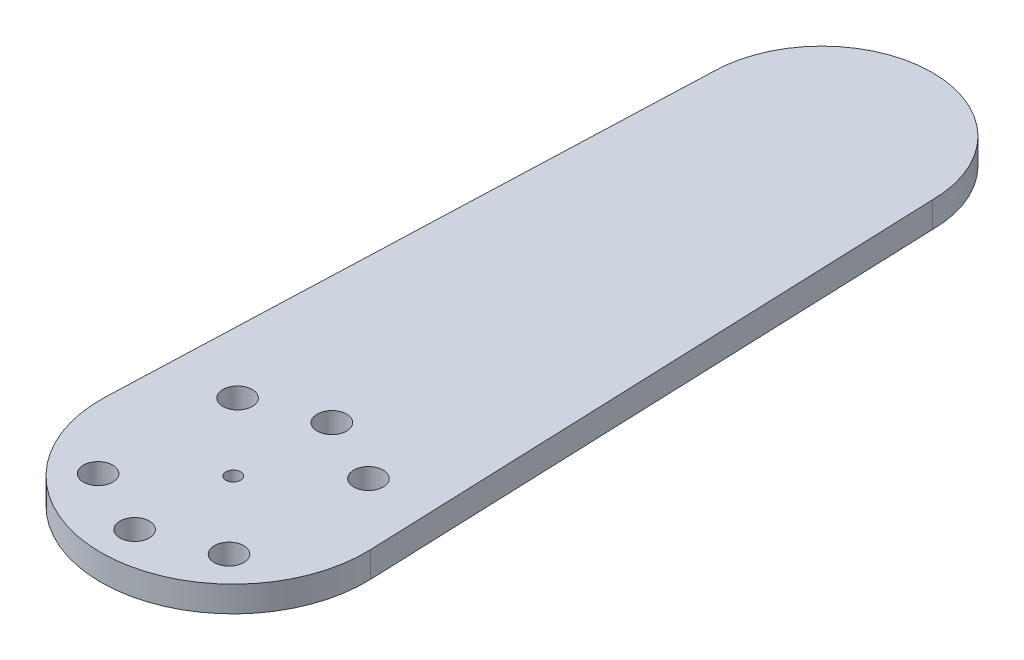
ISO-10303-21;
HEADER;
FILE_DESCRIPTION(('STEP AP214'),'2;1');
FILE_NAME('part.step','',(''),(''),'','','');
FILE_SCHEMA(('AUTOMOTIVE_DESIGN { 1 0 10303 214 1 1 1 1 }'));
ENDSEC;
DATA;
#1=APPLICATION_CONTEXT('core data for automotive mechanical design processes');
#2=APPLICATION_PROTOCOL_DEFINITION('international standard','automotive_design',2000,#1);
#3=PRODUCT_CONTEXT('',#1,'mechanical');
#4=PRODUCT('Part','Part','',(#3));
#5=PRODUCT_RELATED_PRODUCT_CATEGORY('part','',(#4));
#6=PRODUCT_DEFINITION_FORMATION('','',#4);
#7=PRODUCT_DEFINITION_CONTEXT('part definition',#1,'design');
#8=PRODUCT_DEFINITION('design','',#6,#7);
#9=PRODUCT_DEFINITION_SHAPE('','',#8);
#10=(LENGTH_UNIT() NAMED_UNIT(*) SI_UNIT(.MILLI.,.METRE.));
#11=(NAMED_UNIT(*) PLANE_ANGLE_UNIT() SI_UNIT($,.RADIAN.));
#12=(NAMED_UNIT(*) SI_UNIT($,.STERADIAN.) SOLID_ANGLE_UNIT());
#13=UNCERTAINTY_MEASURE_WITH_UNIT(LENGTH_MEASURE(1.E-05),#10,'distance_accuracy_value','');
#14=(GEOMETRIC_REPRESENTATION_CONTEXT(3) GLOBAL_UNCERTAINTY_ASSIGNED_CONTEXT((#13)) GLOBAL_UNIT_ASSIGNED_CONTEXT((#10,
#11,#12)) REPRESENTATION_CONTEXT('',''));
#15=CARTESIAN_POINT('',(0.,0.,0.));
#16=DIRECTION('',(0.,0.,1.));
#17=DIRECTION('',(1.,0.,0.));
#18=AXIS2_PLACEMENT_3D('',#15,#16,#17);
#19=CARTESIAN_POINT('',(0.,3.5,-80.));
#20=DIRECTION('',(0.,1.,0.));
#21=DIRECTION('',(0.,0.,1.));
#22=AXIS2_PLACEMENT_3D('',#19,#20,#21);
#23=PLANE('',#22);
#24=CARTESIAN_POINT('',(-8.89864082924176,3.5,-9.4770349472894));
#25=DIRECTION('',(0.,-1.,0.));
#26=DIRECTION('',(0.,0.,-1.));
#27=AXIS2_PLACEMENT_3D('',#24,#25,#26);
#28=CIRCLE('',#27,2.);
#29=CARTESIAN_POINT('',(-8.89864082924176,3.5,-11.4770349472894));
#30=VERTEX_POINT('',#29);
#31=EDGE_CURVE('E146',#30,#30,#28,.T.);
#32=ORIENTED_EDGE('',*,*,#31,.T.);
#33=EDGE_LOOP('',(#32));
#34=FACE_BOUND('',#33,.T.);
#35=CARTESIAN_POINT('',(0.408986403069327,3.5,-12.9935649504725));
#36=DIRECTION('',(0.,-1.,0.));
#37=DIRECTION('',(0.,0.,-1.));
#38=AXIS2_PLACEMENT_3D('',#35,#36,#37);
#39=CIRCLE('',#38,2.);
#40=CARTESIAN_POINT('',(0.408986403069327,3.5,-14.9935649504725));
#41=VERTEX_POINT('',#40);
#42=EDGE_CURVE('E140',#41,#41,#39,.T.);
#43=ORIENTED_EDGE('',*,*,#42,.T.);
#44=EDGE_LOOP('',(#43));
#45=FACE_BOUND('',#44,.T.);
#46=CARTESIAN_POINT('',(9.4770349472898,3.5,-8.89864082924547));
#47=DIRECTION('',(0.,-1.,0.));
#48=DIRECTION('',(0.,0.,-1.));
#49=AXIS2_PLACEMENT_3D('',#46,#47,#48);
#50=CIRCLE('',#49,2.);
#51=CARTESIAN_POINT('',(9.4770349472898,3.5,-10.8986408292455));
#52=VERTEX_POINT('',#51);
#53=EDGE_CURVE('E134',#52,#52,#50,.T.);
#54=ORIENTED_EDGE('',*,*,#53,.T.);
#55=EDGE_LOOP('',(#54));
#56=FACE_BOUND('',#55,.T.);
#57=CARTESIAN_POINT('',(8.89864082924587,3.5,9.47703494728629));
#58=DIRECTION('',(0.,-1.,0.));
#59=DIRECTION('',(0.,0.,-1.));
#60=AXIS2_PLACEMENT_3D('',#57,#58,#59);
#61=CIRCLE('',#60,2.);
#62=CARTESIAN_POINT('',(8.89864082924587,3.5,7.47703494728628));
#63=VERTEX_POINT('',#62);
#64=EDGE_CURVE('E128',#63,#63,#61,.T.);
#65=ORIENTED_EDGE('',*,*,#64,.T.);
#66=EDGE_LOOP('',(#65));
#67=FACE_BOUND('',#66,.T.);
#68=CARTESIAN_POINT('',(-9.47703494728569,3.5,8.89864082924236));
#69=DIRECTION('',(0.,-1.,0.));
#70=DIRECTION('',(0.,0.,-1.));
#71=AXIS2_PLACEMENT_3D('',#68,#69,#70);
#72=CIRCLE('',#71,2.);
#73=CARTESIAN_POINT('',(-9.47703494728569,3.5,6.89864082924236));
#74=VERTEX_POINT('',#73);
#75=EDGE_CURVE('E122',#74,#74,#72,.T.);
#76=ORIENTED_EDGE('',*,*,#75,.T.);
#77=EDGE_LOOP('',(#76));
#78=FACE_BOUND('',#77,.T.);
#79=CARTESIAN_POINT('',(-0.408986403065219,3.5,12.9935649504694));
#80=DIRECTION('',(0.,-1.,0.));
#81=DIRECTION('',(0.,0.,-1.));
#82=AXIS2_PLACEMENT_3D('',#79,#80,#81);
#83=CIRCLE('',#82,2.);
#84=CARTESIAN_POINT('',(-0.408986403065219,3.5,10.9935649504694));
#85=VERTEX_POINT('',#84);
#86=EDGE_CURVE('E116',#85,#85,#83,.T.);
#87=ORIENTED_EDGE('',*,*,#86,.T.);
#88=EDGE_LOOP('',(#87));
#89=FACE_BOUND('',#88,.T.);
#90=CARTESIAN_POINT('',(0.,3.5,-80.));
#91=DIRECTION('',(0.,1.,0.));
#92=DIRECTION('',(0.,0.,1.));
#93=AXIS2_PLACEMENT_3D('',#90,#91,#92);
#94=CIRCLE('',#93,15.);
#95=CARTESIAN_POINT('',(15.,3.5,-80.));
#96=VERTEX_POINT('',#95);
#97=CARTESIAN_POINT('',(-15.,3.5,-80.));
#98=VERTEX_POINT('',#97);
#99=EDGE_CURVE('E86',#96,#98,#94,.T.);
#100=ORIENTED_EDGE('',*,*,#99,.T.);
#101=DIRECTION('',(-0.0376328185135142,0.,0.999291634594591));
#102=VECTOR('',#101,1.);
#103=CARTESIAN_POINT('',(-15.,3.5,-80.));
#104=LINE('',#103,#102);
#105=CARTESIAN_POINT('',(-17.9872494227026,3.5,-0.677390733243257));
#106=VERTEX_POINT('',#105);
#107=EDGE_CURVE('E81',#98,#106,#104,.T.);
#108=ORIENTED_EDGE('',*,*,#107,.T.);
#109=CARTESIAN_POINT('',(0.,3.5,0.));
#110=DIRECTION('',(0.,1.,0.));
#111=DIRECTION('',(0.,0.,1.));
#112=AXIS2_PLACEMENT_3D('',#109,#110,#111);
#113=CIRCLE('',#112,18.);
#114=CARTESIAN_POINT('',(17.9872494227026,3.5,-0.67739073324326));
#115=VERTEX_POINT('',#114);
#116=EDGE_CURVE('E84',#106,#115,#113,.T.);
#117=ORIENTED_EDGE('',*,*,#116,.T.);
#118=DIRECTION('',(-0.0376328185135142,0.,-0.999291634594591));
#119=VECTOR('',#118,1.);
#120=CARTESIAN_POINT('',(15.,3.5,-80.));
#121=LINE('',#120,#119);
#122=EDGE_CURVE('E51',#115,#96,#121,.T.);
#123=ORIENTED_EDGE('',*,*,#122,.T.);
#124=EDGE_LOOP('',(#100,#108,#117,#123));
#125=FACE_BOUND('',#124,.T.);
#126=CARTESIAN_POINT('',(0.,3.5,0.));
#127=DIRECTION('',(0.,1.,0.));
#128=DIRECTION('',(0.,0.,1.));
#129=AXIS2_PLACEMENT_3D('',#126,#127,#128);
#130=CIRCLE('',#129,1.);
#131=CARTESIAN_POINT('',(0.,3.5,1.));
#132=VERTEX_POINT('',#131);
#133=EDGE_CURVE('E101',#132,#132,#130,.T.);
#134=ORIENTED_EDGE('',*,*,#133,.F.);
#135=EDGE_LOOP('',(#134));
#136=FACE_BOUND('',#135,.T.);
#137=ADVANCED_FACE('F34',(#34,#45,#56,#67,#78,#89,#125,#136),#23,.T.);
#138=CARTESIAN_POINT('',(0.,0.,-80.));
#139=DIRECTION('',(0.,1.,0.));
#140=DIRECTION('',(0.,0.,1.));
#141=AXIS2_PLACEMENT_3D('',#138,#139,#140);
#142=PLANE('',#141);
#143=CARTESIAN_POINT('',(-8.89864082924176,0.,-9.4770349472894));
#144=DIRECTION('',(0.,-1.,0.));
#145=DIRECTION('',(0.,0.,-1.));
#146=AXIS2_PLACEMENT_3D('',#143,#144,#145);
#147=CIRCLE('',#146,2.);
#148=CARTESIAN_POINT('',(-8.89864082924176,0.,-11.4770349472894));
#149=VERTEX_POINT('',#148);
#150=EDGE_CURVE('E149',#149,#149,#147,.T.);
#151=ORIENTED_EDGE('',*,*,#150,.F.);
#152=EDGE_LOOP('',(#151));
#153=FACE_BOUND('',#152,.T.);
#154=CARTESIAN_POINT('',(0.408986403069327,0.,-12.9935649504725));
#155=DIRECTION('',(0.,-1.,0.));
#156=DIRECTION('',(0.,0.,-1.));
#157=AXIS2_PLACEMENT_3D('',#154,#155,#156);
#158=CIRCLE('',#157,2.);
#159=CARTESIAN_POINT('',(0.408986403069327,0.,-14.9935649504725));
#160=VERTEX_POINT('',#159);
#161=EDGE_CURVE('E143',#160,#160,#158,.T.);
#162=ORIENTED_EDGE('',*,*,#161,.F.);
#163=EDGE_LOOP('',(#162));
#164=FACE_BOUND('',#163,.T.);
#165=CARTESIAN_POINT('',(9.4770349472898,0.,-8.89864082924547));
#166=DIRECTION('',(0.,-1.,0.));
#167=DIRECTION('',(0.,0.,-1.));
#168=AXIS2_PLACEMENT_3D('',#165,#166,#167);
#169=CIRCLE('',#168,2.);
#170=CARTESIAN_POINT('',(9.4770349472898,0.,-10.8986408292455));
#171=VERTEX_POINT('',#170);
#172=EDGE_CURVE('E137',#171,#171,#169,.T.);
#173=ORIENTED_EDGE('',*,*,#172,.F.);
#174=EDGE_LOOP('',(#173));
#175=FACE_BOUND('',#174,.T.);
#176=CARTESIAN_POINT('',(8.89864082924587,0.,9.47703494728629));
#177=DIRECTION('',(0.,-1.,0.));
#178=DIRECTION('',(0.,0.,-1.));
#179=AXIS2_PLACEMENT_3D('',#176,#177,#178);
#180=CIRCLE('',#179,2.);
#181=CARTESIAN_POINT('',(8.89864082924587,0.,7.47703494728628));
#182=VERTEX_POINT('',#181);
#183=EDGE_CURVE('E131',#182,#182,#180,.T.);
#184=ORIENTED_EDGE('',*,*,#183,.F.);
#185=EDGE_LOOP('',(#184));
#186=FACE_BOUND('',#185,.T.);
#187=CARTESIAN_POINT('',(-9.47703494728569,0.,8.89864082924236));
#188=DIRECTION('',(0.,-1.,0.));
#189=DIRECTION('',(0.,0.,-1.));
#190=AXIS2_PLACEMENT_3D('',#187,#188,#189);
#191=CIRCLE('',#190,2.);
#192=CARTESIAN_POINT('',(-9.47703494728569,0.,6.89864082924236));
#193=VERTEX_POINT('',#192);
#194=EDGE_CURVE('E125',#193,#193,#191,.T.);
#195=ORIENTED_EDGE('',*,*,#194,.F.);
#196=EDGE_LOOP('',(#195));
#197=FACE_BOUND('',#196,.T.);
#198=CARTESIAN_POINT('',(-0.408986403065219,0.,12.9935649504694));
#199=DIRECTION('',(0.,-1.,0.));
#200=DIRECTION('',(0.,0.,-1.));
#201=AXIS2_PLACEMENT_3D('',#198,#199,#200);
#202=CIRCLE('',#201,2.);
#203=CARTESIAN_POINT('',(-0.408986403065219,0.,10.9935649504694));
#204=VERTEX_POINT('',#203);
#205=EDGE_CURVE('E119',#204,#204,#202,.T.);
#206=ORIENTED_EDGE('',*,*,#205,.F.);
#207=EDGE_LOOP('',(#206));
#208=FACE_BOUND('',#207,.T.);
#209=CARTESIAN_POINT('',(0.,0.,-80.));
#210=DIRECTION('',(0.,1.,0.));
#211=DIRECTION('',(0.,0.,1.));
#212=AXIS2_PLACEMENT_3D('',#209,#210,#211);
#213=CIRCLE('',#212,15.);
#214=CARTESIAN_POINT('',(15.,0.,-80.));
#215=VERTEX_POINT('',#214);
#216=CARTESIAN_POINT('',(-15.,0.,-80.));
#217=VERTEX_POINT('',#216);
#218=EDGE_CURVE('E98',#215,#217,#213,.T.);
#219=ORIENTED_EDGE('',*,*,#218,.F.);
#220=DIRECTION('',(-0.0376328185135142,0.,-0.999291634594591));
#221=VECTOR('',#220,1.);
#222=CARTESIAN_POINT('',(15.,0.,-80.));
#223=LINE('',#222,#221);
#224=CARTESIAN_POINT('',(17.9872494227026,0.,-0.67739073324326));
#225=VERTEX_POINT('',#224);
#226=EDGE_CURVE('E74',#225,#215,#223,.T.);
#227=ORIENTED_EDGE('',*,*,#226,.F.);
#228=CARTESIAN_POINT('',(0.,0.,0.));
#229=DIRECTION('',(0.,1.,0.));
#230=DIRECTION('',(0.,0.,1.));
#231=AXIS2_PLACEMENT_3D('',#228,#229,#230);
#232=CIRCLE('',#231,18.);
#233=CARTESIAN_POINT('',(-17.9872494227026,0.,-0.677390733243257));
#234=VERTEX_POINT('',#233);
#235=EDGE_CURVE('E68',#234,#225,#232,.T.);
#236=ORIENTED_EDGE('',*,*,#235,.F.);
#237=DIRECTION('',(-0.0376328185135142,0.,0.999291634594591));
#238=VECTOR('',#237,1.);
#239=CARTESIAN_POINT('',(-15.,0.,-80.));
#240=LINE('',#239,#238);
#241=EDGE_CURVE('E90',#217,#234,#240,.T.);
#242=ORIENTED_EDGE('',*,*,#241,.F.);
#243=EDGE_LOOP('',(#219,#227,#236,#242));
#244=FACE_BOUND('',#243,.T.);
#245=CARTESIAN_POINT('',(0.,0.,0.));
#246=DIRECTION('',(0.,1.,0.));
#247=DIRECTION('',(0.,0.,1.));
#248=AXIS2_PLACEMENT_3D('',#245,#246,#247);
#249=CIRCLE('',#248,1.);
#250=CARTESIAN_POINT('',(0.,0.,1.));
#251=VERTEX_POINT('',#250);
#252=EDGE_CURVE('E113',#251,#251,#249,.T.);
#253=ORIENTED_EDGE('',*,*,#252,.T.);
#254=EDGE_LOOP('',(#253));
#255=FACE_BOUND('',#254,.T.);
#256=ADVANCED_FACE('F109',(#153,#164,#175,#186,#197,#208,#244,#255),#142,.F.);
#257=CARTESIAN_POINT('',(0.,3.5,-80.));
#258=DIRECTION('',(0.,-1.,0.));
#259=DIRECTION('',(0.,0.,-1.));
#260=AXIS2_PLACEMENT_3D('',#257,#258,#259);
#261=CYLINDRICAL_SURFACE('',#260,15.);
#262=ORIENTED_EDGE('',*,*,#218,.T.);
#263=DIRECTION('',(0.,-1.,0.));
#264=VECTOR('',#263,1.);
#265=CARTESIAN_POINT('',(-15.,3.5,-80.));
#266=LINE('',#265,#264);
#267=EDGE_CURVE('E11',#98,#217,#266,.T.);
#268=ORIENTED_EDGE('',*,*,#267,.F.);
#269=ORIENTED_EDGE('',*,*,#99,.F.);
#270=DIRECTION('',(0.,-1.,0.));
#271=VECTOR('',#270,1.);
#272=CARTESIAN_POINT('',(15.,3.5,-80.));
#273=LINE('',#272,#271);
#274=EDGE_CURVE('E94',#96,#215,#273,.T.);
#275=ORIENTED_EDGE('',*,*,#274,.T.);
#276=EDGE_LOOP('',(#262,#268,#269,#275));
#277=FACE_BOUND('',#276,.T.);
#278=ADVANCED_FACE('F36',(#277),#261,.T.);
#279=CARTESIAN_POINT('',(-15.,3.5,-80.));
#280=DIRECTION('',(0.999291634594591,0.,0.0376328185135142));
#281=DIRECTION('',(0.0376328185135142,0.,-0.999291634594591));
#282=AXIS2_PLACEMENT_3D('',#279,#280,#281);
#283=PLANE('',#282);
#284=ORIENTED_EDGE('',*,*,#241,.T.);
#285=DIRECTION('',(0.,-1.,0.));
#286=VECTOR('',#285,1.);
#287=CARTESIAN_POINT('',(-17.9872494227026,3.5,-0.677390733243257));
#288=LINE('',#287,#286);
#289=EDGE_CURVE('E43',#106,#234,#288,.T.);
#290=ORIENTED_EDGE('',*,*,#289,.F.);
#291=ORIENTED_EDGE('',*,*,#107,.F.);
#292=ORIENTED_EDGE('',*,*,#267,.T.);
#293=EDGE_LOOP('',(#284,#290,#291,#292));
#294=FACE_BOUND('',#293,.T.);
#295=ADVANCED_FACE('F89',(#294),#283,.F.);
#296=CARTESIAN_POINT('',(0.,3.5,0.));
#297=DIRECTION('',(0.,-1.,0.));
#298=DIRECTION('',(0.,0.,-1.));
#299=AXIS2_PLACEMENT_3D('',#296,#297,#298);
#300=CYLINDRICAL_SURFACE('',#299,18.);
#301=ORIENTED_EDGE('',*,*,#235,.T.);
#302=DIRECTION('',(0.,-1.,0.));
#303=VECTOR('',#302,1.);
#304=CARTESIAN_POINT('',(17.9872494227026,3.5,-0.67739073324326));
#305=LINE('',#304,#303);
#306=EDGE_CURVE('E91',#115,#225,#305,.T.);
#307=ORIENTED_EDGE('',*,*,#306,.F.);
#308=ORIENTED_EDGE('',*,*,#116,.F.);
#309=ORIENTED_EDGE('',*,*,#289,.T.);
#310=EDGE_LOOP('',(#301,#307,#308,#309));
#311=FACE_BOUND('',#310,.T.);
#312=ADVANCED_FACE('F92',(#311),#300,.T.);
#313=CARTESIAN_POINT('',(15.,3.5,-80.));
#314=DIRECTION('',(-0.999291634594591,0.,0.0376328185135142));
#315=DIRECTION('',(0.0376328185135142,0.,0.999291634594591));
#316=AXIS2_PLACEMENT_3D('',#313,#314,#315);
#317=PLANE('',#316);
#318=ORIENTED_EDGE('',*,*,#226,.T.);
#319=ORIENTED_EDGE('',*,*,#274,.F.);
#320=ORIENTED_EDGE('',*,*,#122,.F.);
#321=ORIENTED_EDGE('',*,*,#306,.T.);
#322=EDGE_LOOP('',(#318,#319,#320,#321));
#323=FACE_BOUND('',#322,.T.);
#324=ADVANCED_FACE('F106',(#323),#317,.F.);
#325=CARTESIAN_POINT('',(0.,3.5,0.));
#326=DIRECTION('',(0.,-1.,0.));
#327=DIRECTION('',(0.,0.,-1.));
#328=AXIS2_PLACEMENT_3D('',#325,#326,#327);
#329=CYLINDRICAL_SURFACE('',#328,1.);
#330=ORIENTED_EDGE('',*,*,#133,.T.);
#331=EDGE_LOOP('',(#330));
#332=FACE_BOUND('',#331,.T.);
#333=ORIENTED_EDGE('',*,*,#252,.F.);
#334=EDGE_LOOP('',(#333));
#335=FACE_BOUND('',#334,.T.);
#336=ADVANCED_FACE('F180',(#332,#335),#329,.F.);
#337=CARTESIAN_POINT('',(-0.408986403065219,3.5,12.9935649504694));
#338=DIRECTION('',(0.,-1.,0.));
#339=DIRECTION('',(0.,0.,-1.));
#340=AXIS2_PLACEMENT_3D('',#337,#338,#339);
#341=CYLINDRICAL_SURFACE('',#340,2.);
#342=ORIENTED_EDGE('',*,*,#86,.F.);
#343=EDGE_LOOP('',(#342));
#344=FACE_BOUND('',#343,.T.);
#345=ORIENTED_EDGE('',*,*,#205,.T.);
#346=EDGE_LOOP('',(#345));
#347=FACE_BOUND('',#346,.T.);
#348=ADVANCED_FACE('F177',(#344,#347),#341,.F.);
#349=CARTESIAN_POINT('',(-9.47703494728569,3.5,8.89864082924236));
#350=DIRECTION('',(0.,-1.,0.));
#351=DIRECTION('',(0.,0.,-1.));
#352=AXIS2_PLACEMENT_3D('',#349,#350,#351);
#353=CYLINDRICAL_SURFACE('',#352,2.);
#354=ORIENTED_EDGE('',*,*,#75,.F.);
#355=EDGE_LOOP('',(#354));
#356=FACE_BOUND('',#355,.T.);
#357=ORIENTED_EDGE('',*,*,#194,.T.);
#358=EDGE_LOOP('',(#357));
#359=FACE_BOUND('',#358,.T.);
#360=ADVANCED_FACE('F179',(#356,#359),#353,.F.);
#361=CARTESIAN_POINT('',(8.89864082924587,3.5,9.47703494728629));
#362=DIRECTION('',(0.,-1.,0.));
#363=DIRECTION('',(0.,0.,-1.));
#364=AXIS2_PLACEMENT_3D('',#361,#362,#363);
#365=CYLINDRICAL_SURFACE('',#364,2.);
#366=ORIENTED_EDGE('',*,*,#64,.F.);
#367=EDGE_LOOP('',(#366));
#368=FACE_BOUND('',#367,.T.);
#369=ORIENTED_EDGE('',*,*,#183,.T.);
#370=EDGE_LOOP('',(#369));
#371=FACE_BOUND('',#370,.T.);
#372=ADVANCED_FACE('F187',(#368,#371),#365,.F.);
#373=CARTESIAN_POINT('',(9.4770349472898,3.5,-8.89864082924547));
#374=DIRECTION('',(0.,-1.,0.));
#375=DIRECTION('',(0.,0.,-1.));
#376=AXIS2_PLACEMENT_3D('',#373,#374,#375);
#377=CYLINDRICAL_SURFACE('',#376,2.);
#378=ORIENTED_EDGE('',*,*,#53,.F.);
#379=EDGE_LOOP('',(#378));
#380=FACE_BOUND('',#379,.T.);
#381=ORIENTED_EDGE('',*,*,#172,.T.);
#382=EDGE_LOOP('',(#381));
#383=FACE_BOUND('',#382,.T.);
#384=ADVANCED_FACE('F235',(#380,#383),#377,.F.);
#385=CARTESIAN_POINT('',(0.408986403069327,3.5,-12.9935649504725));
#386=DIRECTION('',(0.,-1.,0.));
#387=DIRECTION('',(0.,0.,-1.));
#388=AXIS2_PLACEMENT_3D('',#385,#386,#387);
#389=CYLINDRICAL_SURFACE('',#388,2.);
#390=ORIENTED_EDGE('',*,*,#42,.F.);
#391=EDGE_LOOP('',(#390));
#392=FACE_BOUND('',#391,.T.);
#393=ORIENTED_EDGE('',*,*,#161,.T.);
#394=EDGE_LOOP('',(#393));
#395=FACE_BOUND('',#394,.T.);
#396=ADVANCED_FACE('F160',(#392,#395),#389,.F.);
#397=CARTESIAN_POINT('',(-8.89864082924176,3.5,-9.4770349472894));
#398=DIRECTION('',(0.,-1.,0.));
#399=DIRECTION('',(0.,0.,-1.));
#400=AXIS2_PLACEMENT_3D('',#397,#398,#399);
#401=CYLINDRICAL_SURFACE('',#400,2.);
#402=ORIENTED_EDGE('',*,*,#31,.F.);
#403=EDGE_LOOP('',(#402));
#404=FACE_BOUND('',#403,.T.);
#405=ORIENTED_EDGE('',*,*,#150,.T.);
#406=EDGE_LOOP('',(#405));
#407=FACE_BOUND('',#406,.T.);
#408=ADVANCED_FACE('F157',(#404,#407),#401,.F.);
#409=CLOSED_SHELL('',(#137,#256,#278,#295,#312,#324,#336,#348,#360,#372,#384,#396,#408));
#410=MANIFOLD_SOLID_BREP('B2',#409);
#411=ADVANCED_BREP_SHAPE_REPRESENTATION('',(#18,#410),#14);
#412=SHAPE_DEFINITION_REPRESENTATION(#9,#411);
ENDSEC;
END-ISO-10303-21;
